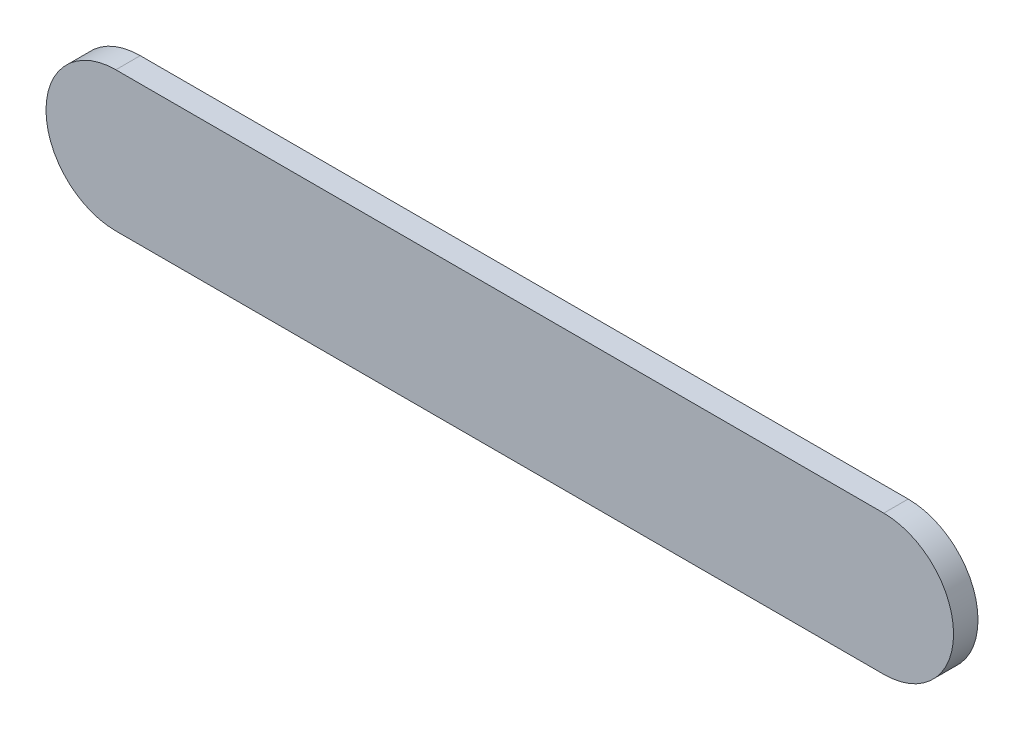
ISO-10303-21;
HEADER;
FILE_DESCRIPTION(('STEP AP214'),'2;1');
FILE_NAME('part.step','',(''),(''),'','','');
FILE_SCHEMA(('AUTOMOTIVE_DESIGN { 1 0 10303 214 1 1 1 1 }'));
ENDSEC;
DATA;
#1=APPLICATION_CONTEXT('core data for automotive mechanical design processes');
#2=APPLICATION_PROTOCOL_DEFINITION('international standard','automotive_design',2000,#1);
#3=PRODUCT_CONTEXT('',#1,'mechanical');
#4=PRODUCT('Part','Part','',(#3));
#5=PRODUCT_RELATED_PRODUCT_CATEGORY('part','',(#4));
#6=PRODUCT_DEFINITION_FORMATION('','',#4);
#7=PRODUCT_DEFINITION_CONTEXT('part definition',#1,'design');
#8=PRODUCT_DEFINITION('design','',#6,#7);
#9=PRODUCT_DEFINITION_SHAPE('','',#8);
#10=(LENGTH_UNIT() NAMED_UNIT(*) SI_UNIT(.MILLI.,.METRE.));
#11=(NAMED_UNIT(*) PLANE_ANGLE_UNIT() SI_UNIT($,.RADIAN.));
#12=(NAMED_UNIT(*) SI_UNIT($,.STERADIAN.) SOLID_ANGLE_UNIT());
#13=UNCERTAINTY_MEASURE_WITH_UNIT(LENGTH_MEASURE(1.E-05),#10,'distance_accuracy_value','');
#14=(GEOMETRIC_REPRESENTATION_CONTEXT(3) GLOBAL_UNCERTAINTY_ASSIGNED_CONTEXT((#13)) GLOBAL_UNIT_ASSIGNED_CONTEXT((#10,
#11,#12)) REPRESENTATION_CONTEXT('',''));
#15=CARTESIAN_POINT('',(0.,0.,0.));
#16=DIRECTION('',(0.,0.,1.));
#17=DIRECTION('',(1.,0.,0.));
#18=AXIS2_PLACEMENT_3D('',#15,#16,#17);
#19=CARTESIAN_POINT('',(85.3275,-106.2175,1.635));
#20=DIRECTION('',(0.,0.,1.));
#21=DIRECTION('',(1.,0.,0.));
#22=AXIS2_PLACEMENT_3D('',#19,#20,#21);
#23=PLANE('',#22);
#24=DIRECTION('',(1.,0.,0.));
#25=VECTOR('',#24,1.);
#26=CARTESIAN_POINT('',(85.3275,-106.2175,1.635));
#27=LINE('',#26,#25);
#28=CARTESIAN_POINT('',(85.3275,-106.2175,1.635));
#29=VERTEX_POINT('',#28);
#30=CARTESIAN_POINT('',(86.4275,-106.2175,1.635));
#31=VERTEX_POINT('',#30);
#32=EDGE_CURVE('E82',#29,#31,#27,.T.);
#33=ORIENTED_EDGE('',*,*,#32,.T.);
#34=CARTESIAN_POINT('',(86.4275,-106.1175,1.635));
#35=DIRECTION('',(0.,0.,1.));
#36=DIRECTION('',(0.,-1.,0.));
#37=AXIS2_PLACEMENT_3D('',#34,#35,#36);
#38=CIRCLE('',#37,0.1);
#39=CARTESIAN_POINT('',(86.4275,-106.0175,1.635));
#40=VERTEX_POINT('',#39);
#41=EDGE_CURVE('E103',#31,#40,#38,.T.);
#42=ORIENTED_EDGE('',*,*,#41,.T.);
#43=DIRECTION('',(-1.,0.,0.));
#44=VECTOR('',#43,1.);
#45=CARTESIAN_POINT('',(86.4275,-106.0175,1.635));
#46=LINE('',#45,#44);
#47=CARTESIAN_POINT('',(85.3275,-106.0175,1.635));
#48=VERTEX_POINT('',#47);
#49=EDGE_CURVE('E75',#40,#48,#46,.T.);
#50=ORIENTED_EDGE('',*,*,#49,.T.);
#51=CARTESIAN_POINT('',(85.3275,-106.1175,1.635));
#52=DIRECTION('',(0.,0.,1.));
#53=DIRECTION('',(-1.42108547152E-13,1.,0.));
#54=AXIS2_PLACEMENT_3D('',#51,#52,#53);
#55=CIRCLE('',#54,0.1);
#56=EDGE_CURVE('E11',#48,#29,#55,.T.);
#57=ORIENTED_EDGE('',*,*,#56,.T.);
#58=EDGE_LOOP('',(#33,#42,#50,#57));
#59=FACE_BOUND('',#58,.T.);
#60=ADVANCED_FACE('F17',(#59),#23,.T.);
#61=CARTESIAN_POINT('',(85.3275,-106.2175,1.6));
#62=DIRECTION('',(0.,0.,1.));
#63=DIRECTION('',(1.,0.,0.));
#64=AXIS2_PLACEMENT_3D('',#61,#62,#63);
#65=PLANE('',#64);
#66=CARTESIAN_POINT('',(85.3275,-106.1175,1.6));
#67=DIRECTION('',(0.,0.,1.));
#68=DIRECTION('',(-1.42108547152E-13,1.,0.));
#69=AXIS2_PLACEMENT_3D('',#66,#67,#68);
#70=CIRCLE('',#69,0.1);
#71=CARTESIAN_POINT('',(85.3275,-106.0175,1.6));
#72=VERTEX_POINT('',#71);
#73=CARTESIAN_POINT('',(85.3275,-106.2175,1.6));
#74=VERTEX_POINT('',#73);
#75=EDGE_CURVE('E20',#72,#74,#70,.T.);
#76=ORIENTED_EDGE('',*,*,#75,.F.);
#77=DIRECTION('',(-1.,0.,0.));
#78=VECTOR('',#77,1.);
#79=CARTESIAN_POINT('',(86.4275,-106.0175,1.6));
#80=LINE('',#79,#78);
#81=CARTESIAN_POINT('',(86.4275,-106.0175,1.6));
#82=VERTEX_POINT('',#81);
#83=EDGE_CURVE('E107',#82,#72,#80,.T.);
#84=ORIENTED_EDGE('',*,*,#83,.F.);
#85=CARTESIAN_POINT('',(86.4275,-106.1175,1.6));
#86=DIRECTION('',(0.,0.,1.));
#87=DIRECTION('',(0.,-1.,0.));
#88=AXIS2_PLACEMENT_3D('',#85,#86,#87);
#89=CIRCLE('',#88,0.1);
#90=CARTESIAN_POINT('',(86.4275,-106.2175,1.6));
#91=VERTEX_POINT('',#90);
#92=EDGE_CURVE('E84',#91,#82,#89,.T.);
#93=ORIENTED_EDGE('',*,*,#92,.F.);
#94=DIRECTION('',(1.,0.,0.));
#95=VECTOR('',#94,1.);
#96=CARTESIAN_POINT('',(85.3275,-106.2175,1.6));
#97=LINE('',#96,#95);
#98=EDGE_CURVE('E80',#74,#91,#97,.T.);
#99=ORIENTED_EDGE('',*,*,#98,.F.);
#100=EDGE_LOOP('',(#76,#84,#93,#99));
#101=FACE_BOUND('',#100,.T.);
#102=ADVANCED_FACE('F86',(#101),#65,.F.);
#103=CARTESIAN_POINT('',(85.3275,-106.1175,1.6));
#104=DIRECTION('',(0.,0.,-1.));
#105=DIRECTION('',(-1.42108547152E-13,1.,0.));
#106=AXIS2_PLACEMENT_3D('',#103,#104,#105);
#107=CYLINDRICAL_SURFACE('',#106,0.1);
#108=ORIENTED_EDGE('',*,*,#75,.T.);
#109=DIRECTION('',(0.,0.,1.));
#110=VECTOR('',#109,1.);
#111=CARTESIAN_POINT('',(85.3275,-106.2175,1.6));
#112=LINE('',#111,#110);
#113=EDGE_CURVE('E69',#74,#29,#112,.T.);
#114=ORIENTED_EDGE('',*,*,#113,.T.);
#115=ORIENTED_EDGE('',*,*,#56,.F.);
#116=DIRECTION('',(0.,0.,1.));
#117=VECTOR('',#116,1.);
#118=CARTESIAN_POINT('',(85.3275,-106.0175,1.6));
#119=LINE('',#118,#117);
#120=EDGE_CURVE('E72',#72,#48,#119,.T.);
#121=ORIENTED_EDGE('',*,*,#120,.F.);
#122=EDGE_LOOP('',(#108,#114,#115,#121));
#123=FACE_BOUND('',#122,.T.);
#124=ADVANCED_FACE('F68',(#123),#107,.T.);
#125=CARTESIAN_POINT('',(86.4275,-106.0175,1.6));
#126=DIRECTION('',(0.,-1.,0.));
#127=DIRECTION('',(0.,0.,-1.));
#128=AXIS2_PLACEMENT_3D('',#125,#126,#127);
#129=PLANE('',#128);
#130=ORIENTED_EDGE('',*,*,#83,.T.);
#131=ORIENTED_EDGE('',*,*,#120,.T.);
#132=ORIENTED_EDGE('',*,*,#49,.F.);
#133=DIRECTION('',(0.,0.,1.));
#134=VECTOR('',#133,1.);
#135=CARTESIAN_POINT('',(86.4275,-106.0175,1.6));
#136=LINE('',#135,#134);
#137=EDGE_CURVE('E102',#82,#40,#136,.T.);
#138=ORIENTED_EDGE('',*,*,#137,.F.);
#139=EDGE_LOOP('',(#130,#131,#132,#138));
#140=FACE_BOUND('',#139,.T.);
#141=ADVANCED_FACE('F120',(#140),#129,.F.);
#142=CARTESIAN_POINT('',(86.4275,-106.1175,1.6));
#143=DIRECTION('',(0.,0.,-1.));
#144=DIRECTION('',(0.,-1.,0.));
#145=AXIS2_PLACEMENT_3D('',#142,#143,#144);
#146=CYLINDRICAL_SURFACE('',#145,0.1);
#147=ORIENTED_EDGE('',*,*,#92,.T.);
#148=ORIENTED_EDGE('',*,*,#137,.T.);
#149=ORIENTED_EDGE('',*,*,#41,.F.);
#150=DIRECTION('',(0.,0.,1.));
#151=VECTOR('',#150,1.);
#152=CARTESIAN_POINT('',(86.4275,-106.2175,1.6));
#153=LINE('',#152,#151);
#154=EDGE_CURVE('E90',#91,#31,#153,.T.);
#155=ORIENTED_EDGE('',*,*,#154,.F.);
#156=EDGE_LOOP('',(#147,#148,#149,#155));
#157=FACE_BOUND('',#156,.T.);
#158=ADVANCED_FACE('F122',(#157),#146,.T.);
#159=CARTESIAN_POINT('',(85.3275,-106.2175,1.6));
#160=DIRECTION('',(0.,1.,0.));
#161=DIRECTION('',(1.,0.,0.));
#162=AXIS2_PLACEMENT_3D('',#159,#160,#161);
#163=PLANE('',#162);
#164=ORIENTED_EDGE('',*,*,#98,.T.);
#165=ORIENTED_EDGE('',*,*,#154,.T.);
#166=ORIENTED_EDGE('',*,*,#32,.F.);
#167=ORIENTED_EDGE('',*,*,#113,.F.);
#168=EDGE_LOOP('',(#164,#165,#166,#167));
#169=FACE_BOUND('',#168,.T.);
#170=ADVANCED_FACE('F78',(#169),#163,.F.);
#171=CLOSED_SHELL('',(#60,#102,#124,#141,#158,#170));
#172=MANIFOLD_SOLID_BREP('B1',#171);
#173=ADVANCED_BREP_SHAPE_REPRESENTATION('',(#18,#172),#14);
#174=SHAPE_DEFINITION_REPRESENTATION(#9,#173);
ENDSEC;
END-ISO-10303-21;
